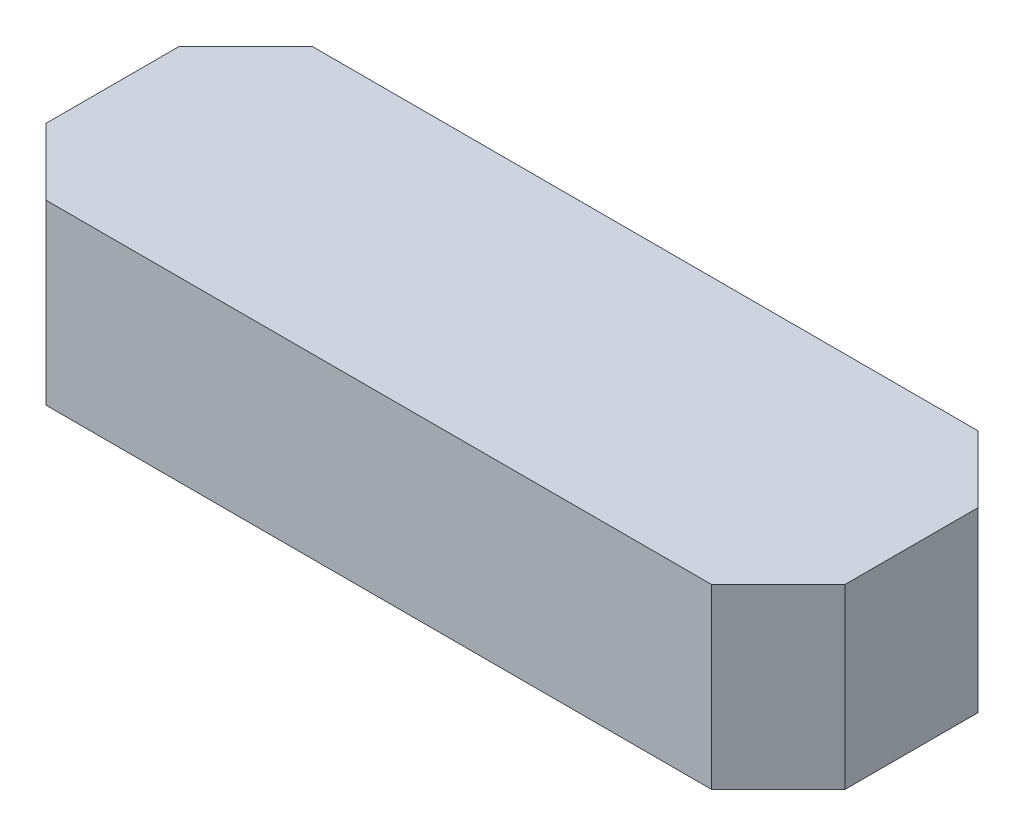
ISO-10303-21;
HEADER;
FILE_DESCRIPTION(('STEP AP214'),'2;1');
FILE_NAME('part.step','',(''),(''),'','','');
FILE_SCHEMA(('AUTOMOTIVE_DESIGN { 1 0 10303 214 1 1 1 1 }'));
ENDSEC;
DATA;
#1=APPLICATION_CONTEXT('core data for automotive mechanical design processes');
#2=APPLICATION_PROTOCOL_DEFINITION('international standard','automotive_design',2000,#1);
#3=PRODUCT_CONTEXT('',#1,'mechanical');
#4=PRODUCT('Part','Part','',(#3));
#5=PRODUCT_RELATED_PRODUCT_CATEGORY('part','',(#4));
#6=PRODUCT_DEFINITION_FORMATION('','',#4);
#7=PRODUCT_DEFINITION_CONTEXT('part definition',#1,'design');
#8=PRODUCT_DEFINITION('design','',#6,#7);
#9=PRODUCT_DEFINITION_SHAPE('','',#8);
#10=(LENGTH_UNIT() NAMED_UNIT(*) SI_UNIT(.MILLI.,.METRE.));
#11=(NAMED_UNIT(*) PLANE_ANGLE_UNIT() SI_UNIT($,.RADIAN.));
#12=(NAMED_UNIT(*) SI_UNIT($,.STERADIAN.) SOLID_ANGLE_UNIT());
#13=UNCERTAINTY_MEASURE_WITH_UNIT(LENGTH_MEASURE(1.E-05),#10,'distance_accuracy_value','');
#14=(GEOMETRIC_REPRESENTATION_CONTEXT(3) GLOBAL_UNCERTAINTY_ASSIGNED_CONTEXT((#13)) GLOBAL_UNIT_ASSIGNED_CONTEXT((#10,
#11,#12)) REPRESENTATION_CONTEXT('',''));
#15=CARTESIAN_POINT('',(0.,0.,0.));
#16=DIRECTION('',(0.,0.,1.));
#17=DIRECTION('',(1.,0.,0.));
#18=AXIS2_PLACEMENT_3D('',#15,#16,#17);
#19=CARTESIAN_POINT('',(18.,-5.,0.));
#20=DIRECTION('',(-1.,0.,0.));
#21=DIRECTION('',(0.,0.,1.));
#22=AXIS2_PLACEMENT_3D('',#19,#20,#21);
#23=PLANE('',#22);
#24=DIRECTION('',(0.,0.,-1.));
#25=VECTOR('',#24,1.);
#26=CARTESIAN_POINT('',(18.,3.,6.));
#27=LINE('',#26,#25);
#28=CARTESIAN_POINT('',(18.,3.,2.99999999999999));
#29=VERTEX_POINT('',#28);
#30=CARTESIAN_POINT('',(18.,3.,-3.));
#31=VERTEX_POINT('',#30);
#32=EDGE_CURVE('E225',#29,#31,#27,.T.);
#33=ORIENTED_EDGE('',*,*,#32,.F.);
#34=DIRECTION('',(0.,-1.,0.));
#35=VECTOR('',#34,1.);
#36=CARTESIAN_POINT('',(18.,-5.,2.99999999999999));
#37=LINE('',#36,#35);
#38=CARTESIAN_POINT('',(18.,-5.,2.99999999999999));
#39=VERTEX_POINT('',#38);
#40=EDGE_CURVE('E143',#29,#39,#37,.T.);
#41=ORIENTED_EDGE('',*,*,#40,.T.);
#42=DIRECTION('',(0.,0.,1.));
#43=VECTOR('',#42,1.);
#44=CARTESIAN_POINT('',(18.,-5.,0.));
#45=LINE('',#44,#43);
#46=CARTESIAN_POINT('',(18.,-5.,-3.));
#47=VERTEX_POINT('',#46);
#48=EDGE_CURVE('E160',#47,#39,#45,.T.);
#49=ORIENTED_EDGE('',*,*,#48,.F.);
#50=DIRECTION('',(0.,1.,0.));
#51=VECTOR('',#50,1.);
#52=CARTESIAN_POINT('',(18.,-5.,-3.));
#53=LINE('',#52,#51);
#54=EDGE_CURVE('E140',#47,#31,#53,.T.);
#55=ORIENTED_EDGE('',*,*,#54,.T.);
#56=EDGE_LOOP('',(#33,#41,#49,#55));
#57=FACE_BOUND('',#56,.T.);
#58=ADVANCED_FACE('F37',(#57),#23,.F.);
#59=CARTESIAN_POINT('',(0.,-5.,6.));
#60=DIRECTION('',(0.,0.,1.));
#61=DIRECTION('',(1.,0.,0.));
#62=AXIS2_PLACEMENT_3D('',#59,#60,#61);
#63=PLANE('',#62);
#64=DIRECTION('',(1.,0.,0.));
#65=VECTOR('',#64,1.);
#66=CARTESIAN_POINT('',(0.,-5.,6.));
#67=LINE('',#66,#65);
#68=CARTESIAN_POINT('',(-15.,-5.,6.));
#69=VERTEX_POINT('',#68);
#70=CARTESIAN_POINT('',(15.,-5.,6.));
#71=VERTEX_POINT('',#70);
#72=EDGE_CURVE('E127',#69,#71,#67,.T.);
#73=ORIENTED_EDGE('',*,*,#72,.T.);
#74=DIRECTION('',(0.,1.,0.));
#75=VECTOR('',#74,1.);
#76=CARTESIAN_POINT('',(15.,3.,6.));
#77=LINE('',#76,#75);
#78=CARTESIAN_POINT('',(15.,3.,6.));
#79=VERTEX_POINT('',#78);
#80=EDGE_CURVE('E114',#71,#79,#77,.T.);
#81=ORIENTED_EDGE('',*,*,#80,.T.);
#82=DIRECTION('',(1.,0.,0.));
#83=VECTOR('',#82,1.);
#84=CARTESIAN_POINT('',(-18.,3.,6.));
#85=LINE('',#84,#83);
#86=CARTESIAN_POINT('',(-15.,3.,6.));
#87=VERTEX_POINT('',#86);
#88=EDGE_CURVE('E106',#87,#79,#85,.T.);
#89=ORIENTED_EDGE('',*,*,#88,.F.);
#90=DIRECTION('',(0.,-1.,0.));
#91=VECTOR('',#90,1.);
#92=CARTESIAN_POINT('',(-15.,-5.,6.));
#93=LINE('',#92,#91);
#94=EDGE_CURVE('E120',#87,#69,#93,.T.);
#95=ORIENTED_EDGE('',*,*,#94,.T.);
#96=EDGE_LOOP('',(#73,#81,#89,#95));
#97=FACE_BOUND('',#96,.T.);
#98=ADVANCED_FACE('F119',(#97),#63,.T.);
#99=CARTESIAN_POINT('',(-18.,-5.,0.));
#100=DIRECTION('',(-1.,0.,0.));
#101=DIRECTION('',(0.,0.,1.));
#102=AXIS2_PLACEMENT_3D('',#99,#100,#101);
#103=PLANE('',#102);
#104=DIRECTION('',(0.,0.,1.));
#105=VECTOR('',#104,1.);
#106=CARTESIAN_POINT('',(-18.,3.,6.));
#107=LINE('',#106,#105);
#108=CARTESIAN_POINT('',(-18.,3.,-2.99999999999999));
#109=VERTEX_POINT('',#108);
#110=CARTESIAN_POINT('',(-18.,3.,3.));
#111=VERTEX_POINT('',#110);
#112=EDGE_CURVE('E108',#109,#111,#107,.T.);
#113=ORIENTED_EDGE('',*,*,#112,.F.);
#114=DIRECTION('',(0.,-1.,0.));
#115=VECTOR('',#114,1.);
#116=CARTESIAN_POINT('',(-18.,-5.,-2.99999999999999));
#117=LINE('',#116,#115);
#118=CARTESIAN_POINT('',(-18.,-5.,-2.99999999999999));
#119=VERTEX_POINT('',#118);
#120=EDGE_CURVE('E11',#109,#119,#117,.T.);
#121=ORIENTED_EDGE('',*,*,#120,.T.);
#122=DIRECTION('',(0.,0.,1.));
#123=VECTOR('',#122,1.);
#124=CARTESIAN_POINT('',(-18.,-5.,0.));
#125=LINE('',#124,#123);
#126=CARTESIAN_POINT('',(-18.,-5.,3.));
#127=VERTEX_POINT('',#126);
#128=EDGE_CURVE('E130',#119,#127,#125,.T.);
#129=ORIENTED_EDGE('',*,*,#128,.T.);
#130=DIRECTION('',(0.,1.,0.));
#131=VECTOR('',#130,1.);
#132=CARTESIAN_POINT('',(-18.,-5.,3.));
#133=LINE('',#132,#131);
#134=EDGE_CURVE('E45',#127,#111,#133,.T.);
#135=ORIENTED_EDGE('',*,*,#134,.T.);
#136=EDGE_LOOP('',(#113,#121,#129,#135));
#137=FACE_BOUND('',#136,.T.);
#138=ADVANCED_FACE('F156',(#137),#103,.T.);
#139=CARTESIAN_POINT('',(-11.845,-5.,0.));
#140=DIRECTION('',(0.,1.,0.));
#141=DIRECTION('',(0.,0.,1.));
#142=AXIS2_PLACEMENT_3D('',#139,#140,#141);
#143=CYLINDRICAL_SURFACE('',#142,4.);
#144=CARTESIAN_POINT('',(-11.845,-5.,0.));
#145=DIRECTION('',(0.,1.,0.));
#146=DIRECTION('',(0.,0.,1.));
#147=AXIS2_PLACEMENT_3D('',#144,#145,#146);
#148=CIRCLE('',#147,4.);
#149=CARTESIAN_POINT('',(-11.845,-5.,4.));
#150=VERTEX_POINT('',#149);
#151=EDGE_CURVE('E169',#150,#150,#148,.T.);
#152=ORIENTED_EDGE('',*,*,#151,.F.);
#153=EDGE_LOOP('',(#152));
#154=FACE_BOUND('',#153,.T.);
#155=CARTESIAN_POINT('',(-11.845,0.,0.));
#156=DIRECTION('',(0.,1.,0.));
#157=DIRECTION('',(0.,0.,1.));
#158=AXIS2_PLACEMENT_3D('',#155,#156,#157);
#159=CIRCLE('',#158,4.);
#160=CARTESIAN_POINT('',(-11.845,0.,4.));
#161=VERTEX_POINT('',#160);
#162=EDGE_CURVE('E123',#161,#161,#159,.T.);
#163=ORIENTED_EDGE('',*,*,#162,.T.);
#164=EDGE_LOOP('',(#163));
#165=FACE_BOUND('',#164,.T.);
#166=ADVANCED_FACE('F174',(#154,#165),#143,.F.);
#167=CARTESIAN_POINT('',(11.845,-5.,0.));
#168=DIRECTION('',(0.,1.,0.));
#169=DIRECTION('',(0.,0.,1.));
#170=AXIS2_PLACEMENT_3D('',#167,#168,#169);
#171=CYLINDRICAL_SURFACE('',#170,4.);
#172=CARTESIAN_POINT('',(11.845,-5.,0.));
#173=DIRECTION('',(0.,1.,0.));
#174=DIRECTION('',(0.,0.,1.));
#175=AXIS2_PLACEMENT_3D('',#172,#173,#174);
#176=CIRCLE('',#175,4.);
#177=CARTESIAN_POINT('',(11.845,-5.,4.));
#178=VERTEX_POINT('',#177);
#179=EDGE_CURVE('E165',#178,#178,#176,.T.);
#180=ORIENTED_EDGE('',*,*,#179,.F.);
#181=EDGE_LOOP('',(#180));
#182=FACE_BOUND('',#181,.T.);
#183=CARTESIAN_POINT('',(11.845,0.,0.));
#184=DIRECTION('',(0.,1.,0.));
#185=DIRECTION('',(0.,0.,1.));
#186=AXIS2_PLACEMENT_3D('',#183,#184,#185);
#187=CIRCLE('',#186,4.);
#188=CARTESIAN_POINT('',(11.845,0.,4.));
#189=VERTEX_POINT('',#188);
#190=EDGE_CURVE('E163',#189,#189,#187,.T.);
#191=ORIENTED_EDGE('',*,*,#190,.T.);
#192=EDGE_LOOP('',(#191));
#193=FACE_BOUND('',#192,.T.);
#194=ADVANCED_FACE('F203',(#182,#193),#171,.F.);
#195=CARTESIAN_POINT('',(0.,-5.,-6.));
#196=DIRECTION('',(0.,0.,1.));
#197=DIRECTION('',(1.,0.,0.));
#198=AXIS2_PLACEMENT_3D('',#195,#196,#197);
#199=PLANE('',#198);
#200=DIRECTION('',(-1.,0.,0.));
#201=VECTOR('',#200,1.);
#202=CARTESIAN_POINT('',(-18.,3.,-6.));
#203=LINE('',#202,#201);
#204=CARTESIAN_POINT('',(15.,3.,-6.));
#205=VERTEX_POINT('',#204);
#206=CARTESIAN_POINT('',(-15.,3.,-6.));
#207=VERTEX_POINT('',#206);
#208=EDGE_CURVE('E223',#205,#207,#203,.T.);
#209=ORIENTED_EDGE('',*,*,#208,.F.);
#210=DIRECTION('',(0.,-1.,0.));
#211=VECTOR('',#210,1.);
#212=CARTESIAN_POINT('',(15.,-5.,-6.));
#213=LINE('',#212,#211);
#214=CARTESIAN_POINT('',(15.,-5.,-6.));
#215=VERTEX_POINT('',#214);
#216=EDGE_CURVE('E52',#205,#215,#213,.T.);
#217=ORIENTED_EDGE('',*,*,#216,.T.);
#218=DIRECTION('',(1.,0.,0.));
#219=VECTOR('',#218,1.);
#220=CARTESIAN_POINT('',(0.,-5.,-6.));
#221=LINE('',#220,#219);
#222=CARTESIAN_POINT('',(-15.,-5.,-6.));
#223=VERTEX_POINT('',#222);
#224=EDGE_CURVE('E158',#223,#215,#221,.T.);
#225=ORIENTED_EDGE('',*,*,#224,.F.);
#226=DIRECTION('',(0.,1.,0.));
#227=VECTOR('',#226,1.);
#228=CARTESIAN_POINT('',(-15.,3.,-6.));
#229=LINE('',#228,#227);
#230=EDGE_CURVE('E151',#223,#207,#229,.T.);
#231=ORIENTED_EDGE('',*,*,#230,.T.);
#232=EDGE_LOOP('',(#209,#217,#225,#231));
#233=FACE_BOUND('',#232,.T.);
#234=ADVANCED_FACE('F186',(#233),#199,.F.);
#235=CARTESIAN_POINT('',(0.,-5.,0.));
#236=DIRECTION('',(0.,1.,0.));
#237=DIRECTION('',(0.,0.,1.));
#238=AXIS2_PLACEMENT_3D('',#235,#236,#237);
#239=PLANE('',#238);
#240=ORIENTED_EDGE('',*,*,#179,.T.);
#241=EDGE_LOOP('',(#240));
#242=FACE_BOUND('',#241,.T.);
#243=ORIENTED_EDGE('',*,*,#151,.T.);
#244=EDGE_LOOP('',(#243));
#245=FACE_BOUND('',#244,.T.);
#246=ORIENTED_EDGE('',*,*,#48,.T.);
#247=DIRECTION('',(-0.707106781186546,0.,0.707106781186549));
#248=VECTOR('',#247,1.);
#249=CARTESIAN_POINT('',(15.,-5.,6.));
#250=LINE('',#249,#248);
#251=EDGE_CURVE('E149',#39,#71,#250,.T.);
#252=ORIENTED_EDGE('',*,*,#251,.T.);
#253=ORIENTED_EDGE('',*,*,#72,.F.);
#254=DIRECTION('',(0.707106781186548,0.,0.707106781186547));
#255=VECTOR('',#254,1.);
#256=CARTESIAN_POINT('',(-18.,-5.,3.));
#257=LINE('',#256,#255);
#258=EDGE_CURVE('E126',#69,#127,#257,.F.);
#259=ORIENTED_EDGE('',*,*,#258,.T.);
#260=ORIENTED_EDGE('',*,*,#128,.F.);
#261=DIRECTION('',(0.707106781186547,0.,-0.707106781186548));
#262=VECTOR('',#261,1.);
#263=CARTESIAN_POINT('',(-15.,-5.,-6.));
#264=LINE('',#263,#262);
#265=EDGE_CURVE('E59',#119,#223,#264,.T.);
#266=ORIENTED_EDGE('',*,*,#265,.T.);
#267=ORIENTED_EDGE('',*,*,#224,.T.);
#268=DIRECTION('',(-0.707106781186548,0.,-0.707106781186547));
#269=VECTOR('',#268,1.);
#270=CARTESIAN_POINT('',(18.,-5.,-3.));
#271=LINE('',#270,#269);
#272=EDGE_CURVE('E147',#215,#47,#271,.F.);
#273=ORIENTED_EDGE('',*,*,#272,.T.);
#274=EDGE_LOOP('',(#246,#252,#253,#259,#260,#266,#267,#273));
#275=FACE_BOUND('',#274,.T.);
#276=ADVANCED_FACE('F179',(#242,#245,#275),#239,.F.);
#277=CARTESIAN_POINT('',(0.,0.,0.));
#278=DIRECTION('',(0.,-1.,0.));
#279=DIRECTION('',(0.,0.,-1.));
#280=AXIS2_PLACEMENT_3D('',#277,#278,#279);
#281=PLANE('',#280);
#282=ORIENTED_EDGE('',*,*,#162,.F.);
#283=EDGE_LOOP('',(#282));
#284=FACE_BOUND('',#283,.T.);
#285=ADVANCED_FACE('F176',(#284),#281,.T.);
#286=ORIENTED_EDGE('',*,*,#190,.F.);
#287=EDGE_LOOP('',(#286));
#288=FACE_BOUND('',#287,.T.);
#289=ADVANCED_FACE('F178',(#288),#281,.T.);
#290=CARTESIAN_POINT('',(0.,3.,0.));
#291=DIRECTION('',(0.,-1.,0.));
#292=DIRECTION('',(0.,0.,-1.));
#293=AXIS2_PLACEMENT_3D('',#290,#291,#292);
#294=PLANE('',#293);
#295=ORIENTED_EDGE('',*,*,#88,.T.);
#296=DIRECTION('',(0.707106781186546,0.,-0.707106781186549));
#297=VECTOR('',#296,1.);
#298=CARTESIAN_POINT('',(15.,3.,6.));
#299=LINE('',#298,#297);
#300=EDGE_CURVE('E138',#79,#29,#299,.T.);
#301=ORIENTED_EDGE('',*,*,#300,.T.);
#302=ORIENTED_EDGE('',*,*,#32,.T.);
#303=DIRECTION('',(0.707106781186548,0.,0.707106781186547));
#304=VECTOR('',#303,1.);
#305=CARTESIAN_POINT('',(18.,3.,-3.));
#306=LINE('',#305,#304);
#307=EDGE_CURVE('E136',#31,#205,#306,.F.);
#308=ORIENTED_EDGE('',*,*,#307,.T.);
#309=ORIENTED_EDGE('',*,*,#208,.T.);
#310=DIRECTION('',(-0.707106781186547,0.,0.707106781186548));
#311=VECTOR('',#310,1.);
#312=CARTESIAN_POINT('',(-15.,3.,-6.));
#313=LINE('',#312,#311);
#314=EDGE_CURVE('E113',#207,#109,#313,.T.);
#315=ORIENTED_EDGE('',*,*,#314,.T.);
#316=ORIENTED_EDGE('',*,*,#112,.T.);
#317=DIRECTION('',(-0.707106781186548,0.,-0.707106781186547));
#318=VECTOR('',#317,1.);
#319=CARTESIAN_POINT('',(-18.,3.,3.));
#320=LINE('',#319,#318);
#321=EDGE_CURVE('E103',#111,#87,#320,.F.);
#322=ORIENTED_EDGE('',*,*,#321,.T.);
#323=EDGE_LOOP('',(#295,#301,#302,#308,#309,#315,#316,#322));
#324=FACE_BOUND('',#323,.T.);
#325=ADVANCED_FACE('F105',(#324),#294,.F.);
#326=CARTESIAN_POINT('',(15.,-5.,6.));
#327=DIRECTION('',(0.707106781186549,0.,0.707106781186546));
#328=DIRECTION('',(0.,-1.,0.));
#329=AXIS2_PLACEMENT_3D('',#326,#327,#328);
#330=PLANE('',#329);
#331=ORIENTED_EDGE('',*,*,#251,.F.);
#332=ORIENTED_EDGE('',*,*,#40,.F.);
#333=ORIENTED_EDGE('',*,*,#300,.F.);
#334=ORIENTED_EDGE('',*,*,#80,.F.);
#335=EDGE_LOOP('',(#331,#332,#333,#334));
#336=FACE_BOUND('',#335,.T.);
#337=ADVANCED_FACE('F208',(#336),#330,.T.);
#338=CARTESIAN_POINT('',(18.,-5.,-3.));
#339=DIRECTION('',(-0.707106781186547,0.,0.707106781186548));
#340=DIRECTION('',(0.,1.,0.));
#341=AXIS2_PLACEMENT_3D('',#338,#339,#340);
#342=PLANE('',#341);
#343=ORIENTED_EDGE('',*,*,#272,.F.);
#344=ORIENTED_EDGE('',*,*,#216,.F.);
#345=ORIENTED_EDGE('',*,*,#307,.F.);
#346=ORIENTED_EDGE('',*,*,#54,.F.);
#347=EDGE_LOOP('',(#343,#344,#345,#346));
#348=FACE_BOUND('',#347,.T.);
#349=ADVANCED_FACE('F211',(#348),#342,.F.);
#350=CARTESIAN_POINT('',(-15.,-5.,-6.));
#351=DIRECTION('',(-0.707106781186548,0.,-0.707106781186547));
#352=DIRECTION('',(0.,-1.,0.));
#353=AXIS2_PLACEMENT_3D('',#350,#351,#352);
#354=PLANE('',#353);
#355=ORIENTED_EDGE('',*,*,#265,.F.);
#356=ORIENTED_EDGE('',*,*,#120,.F.);
#357=ORIENTED_EDGE('',*,*,#314,.F.);
#358=ORIENTED_EDGE('',*,*,#230,.F.);
#359=EDGE_LOOP('',(#355,#356,#357,#358));
#360=FACE_BOUND('',#359,.T.);
#361=ADVANCED_FACE('F214',(#360),#354,.T.);
#362=CARTESIAN_POINT('',(-18.,-5.,3.));
#363=DIRECTION('',(0.707106781186547,0.,-0.707106781186548));
#364=DIRECTION('',(0.,1.,0.));
#365=AXIS2_PLACEMENT_3D('',#362,#363,#364);
#366=PLANE('',#365);
#367=ORIENTED_EDGE('',*,*,#258,.F.);
#368=ORIENTED_EDGE('',*,*,#94,.F.);
#369=ORIENTED_EDGE('',*,*,#321,.F.);
#370=ORIENTED_EDGE('',*,*,#134,.F.);
#371=EDGE_LOOP('',(#367,#368,#369,#370));
#372=FACE_BOUND('',#371,.T.);
#373=ADVANCED_FACE('F39',(#372),#366,.F.);
#374=CLOSED_SHELL('',(#58,#98,#138,#166,#194,#234,#276,#285,#289,#325,#337,#349,#361,#373));
#375=MANIFOLD_SOLID_BREP('B2',#374);
#376=ADVANCED_BREP_SHAPE_REPRESENTATION('',(#18,#375),#14);
#377=SHAPE_DEFINITION_REPRESENTATION(#9,#376);
ENDSEC;
END-ISO-10303-21;
